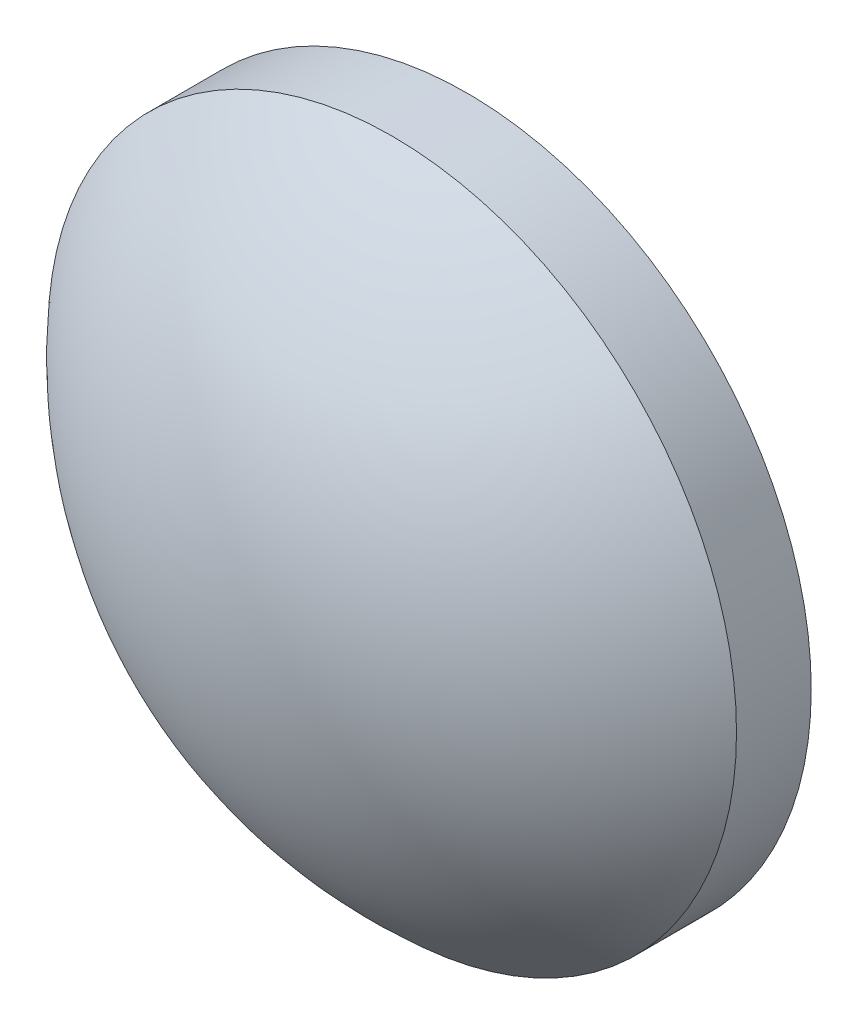
ISO-10303-21;
HEADER;
FILE_DESCRIPTION(('STEP AP214'),'2;1');
FILE_NAME('part.step','',(''),(''),'','','');
FILE_SCHEMA(('AUTOMOTIVE_DESIGN { 1 0 10303 214 1 1 1 1 }'));
ENDSEC;
DATA;
#1=APPLICATION_CONTEXT('core data for automotive mechanical design processes');
#2=APPLICATION_PROTOCOL_DEFINITION('international standard','automotive_design',2000,#1);
#3=PRODUCT_CONTEXT('',#1,'mechanical');
#4=PRODUCT('Part','Part','',(#3));
#5=PRODUCT_RELATED_PRODUCT_CATEGORY('part','',(#4));
#6=PRODUCT_DEFINITION_FORMATION('','',#4);
#7=PRODUCT_DEFINITION_CONTEXT('part definition',#1,'design');
#8=PRODUCT_DEFINITION('design','',#6,#7);
#9=PRODUCT_DEFINITION_SHAPE('','',#8);
#10=(LENGTH_UNIT() NAMED_UNIT(*) SI_UNIT(.MILLI.,.METRE.));
#11=(NAMED_UNIT(*) PLANE_ANGLE_UNIT() SI_UNIT($,.RADIAN.));
#12=(NAMED_UNIT(*) SI_UNIT($,.STERADIAN.) SOLID_ANGLE_UNIT());
#13=UNCERTAINTY_MEASURE_WITH_UNIT(LENGTH_MEASURE(1.E-05),#10,'distance_accuracy_value','');
#14=(GEOMETRIC_REPRESENTATION_CONTEXT(3) GLOBAL_UNCERTAINTY_ASSIGNED_CONTEXT((#13)) GLOBAL_UNIT_ASSIGNED_CONTEXT((#10,
#11,#12)) REPRESENTATION_CONTEXT('',''));
#15=CARTESIAN_POINT('',(0.,0.,0.));
#16=DIRECTION('',(0.,0.,1.));
#17=DIRECTION('',(1.,0.,0.));
#18=AXIS2_PLACEMENT_3D('',#15,#16,#17);
#19=CARTESIAN_POINT('',(0.,0.,1.9220632474807));
#20=DIRECTION('',(0.,0.,1.));
#21=DIRECTION('',(1.,0.,0.));
#22=AXIS2_PLACEMENT_3D('',#19,#20,#21);
#23=CYLINDRICAL_SURFACE('',#22,2.99848065167176);
#24=CARTESIAN_POINT('',(0.,0.,-0.321702890248912));
#25=DIRECTION('',(0.,0.,1.));
#26=DIRECTION('',(1.,0.,0.));
#27=AXIS2_PLACEMENT_3D('',#24,#25,#26);
#28=CIRCLE('',#27,2.99848065167176);
#29=CARTESIAN_POINT('',(2.99848065167176,0.,-0.321702890248912));
#30=VERTEX_POINT('',#29);
#31=EDGE_CURVE('E12',#30,#30,#28,.T.);
#32=ORIENTED_EDGE('',*,*,#31,.F.);
#33=EDGE_LOOP('',(#32));
#34=FACE_BOUND('',#33,.T.);
#35=CARTESIAN_POINT('',(0.,0.,-0.972510965255239));
#36=DIRECTION('',(0.,0.,1.));
#37=DIRECTION('',(1.,0.,0.));
#38=AXIS2_PLACEMENT_3D('',#35,#36,#37);
#39=CIRCLE('',#38,2.99848065167176);
#40=CARTESIAN_POINT('',(2.99848065167176,0.,-0.972510965255239));
#41=VERTEX_POINT('',#40);
#42=EDGE_CURVE('E53',#41,#41,#39,.T.);
#43=ORIENTED_EDGE('',*,*,#42,.T.);
#44=EDGE_LOOP('',(#43));
#45=FACE_BOUND('',#44,.T.);
#46=ADVANCED_FACE('F47',(#34,#45),#23,.T.);
#47=CARTESIAN_POINT('',(0.,0.,-2.96917598388936));
#48=DIRECTION('',(0.,0.,1.));
#49=DIRECTION('',(0.,1.,0.));
#50=AXIS2_PLACEMENT_3D('',#47,#48,#49);
#51=SPHERICAL_SURFACE('',#50,4.);
#52=ORIENTED_EDGE('',*,*,#31,.T.);
#53=EDGE_LOOP('',(#52));
#54=FACE_BOUND('',#53,.T.);
#55=ADVANCED_FACE('F62',(#54),#51,.T.);
#56=CARTESIAN_POINT('',(0.,0.,-0.972510965255239));
#57=DIRECTION('',(0.,0.,1.));
#58=DIRECTION('',(1.,0.,0.));
#59=AXIS2_PLACEMENT_3D('',#56,#57,#58);
#60=PLANE('',#59);
#61=ORIENTED_EDGE('',*,*,#42,.F.);
#62=EDGE_LOOP('',(#61));
#63=FACE_BOUND('',#62,.T.);
#64=ADVANCED_FACE('F60',(#63),#60,.F.);
#65=CLOSED_SHELL('',(#46,#55,#64));
#66=MANIFOLD_SOLID_BREP('B2',#65);
#67=ADVANCED_BREP_SHAPE_REPRESENTATION('',(#18,#66),#14);
#68=SHAPE_DEFINITION_REPRESENTATION(#9,#67);
ENDSEC;
END-ISO-10303-21;
